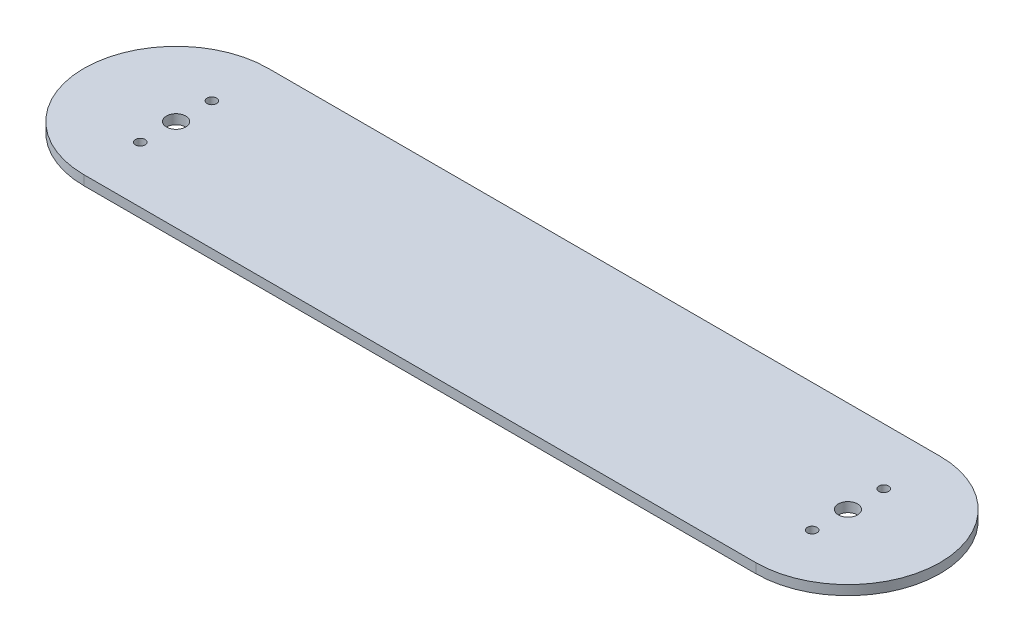
ISO-10303-21;
HEADER;
FILE_DESCRIPTION(('STEP AP214'),'2;1');
FILE_NAME('part.step','',(''),(''),'','','');
FILE_SCHEMA(('AUTOMOTIVE_DESIGN { 1 0 10303 214 1 1 1 1 }'));
ENDSEC;
DATA;
#1=APPLICATION_CONTEXT('core data for automotive mechanical design processes');
#2=APPLICATION_PROTOCOL_DEFINITION('international standard','automotive_design',2000,#1);
#3=PRODUCT_CONTEXT('',#1,'mechanical');
#4=PRODUCT('Part','Part','',(#3));
#5=PRODUCT_RELATED_PRODUCT_CATEGORY('part','',(#4));
#6=PRODUCT_DEFINITION_FORMATION('','',#4);
#7=PRODUCT_DEFINITION_CONTEXT('part definition',#1,'design');
#8=PRODUCT_DEFINITION('design','',#6,#7);
#9=PRODUCT_DEFINITION_SHAPE('','',#8);
#10=(LENGTH_UNIT() NAMED_UNIT(*) SI_UNIT(.MILLI.,.METRE.));
#11=(NAMED_UNIT(*) PLANE_ANGLE_UNIT() SI_UNIT($,.RADIAN.));
#12=(NAMED_UNIT(*) SI_UNIT($,.STERADIAN.) SOLID_ANGLE_UNIT());
#13=UNCERTAINTY_MEASURE_WITH_UNIT(LENGTH_MEASURE(1.E-05),#10,'distance_accuracy_value','');
#14=(GEOMETRIC_REPRESENTATION_CONTEXT(3) GLOBAL_UNCERTAINTY_ASSIGNED_CONTEXT((#13)) GLOBAL_UNIT_ASSIGNED_CONTEXT((#10,
#11,#12)) REPRESENTATION_CONTEXT('',''));
#15=CARTESIAN_POINT('',(0.,0.,0.));
#16=DIRECTION('',(0.,0.,1.));
#17=DIRECTION('',(1.,0.,0.));
#18=AXIS2_PLACEMENT_3D('',#15,#16,#17);
#19=CARTESIAN_POINT('',(-175.,5.,0.));
#20=DIRECTION('',(0.,-1.,0.));
#21=DIRECTION('',(0.,0.,-1.));
#22=AXIS2_PLACEMENT_3D('',#19,#20,#21);
#23=CYLINDRICAL_SURFACE('',#22,48.);
#24=CARTESIAN_POINT('',(-175.,0.,0.));
#25=DIRECTION('',(0.,1.,0.));
#26=DIRECTION('',(0.,0.,1.));
#27=AXIS2_PLACEMENT_3D('',#24,#25,#26);
#28=CIRCLE('',#27,48.);
#29=CARTESIAN_POINT('',(-175.,0.,-48.));
#30=VERTEX_POINT('',#29);
#31=CARTESIAN_POINT('',(-175.,0.,48.));
#32=VERTEX_POINT('',#31);
#33=EDGE_CURVE('E102',#30,#32,#28,.T.);
#34=ORIENTED_EDGE('',*,*,#33,.T.);
#35=DIRECTION('',(0.,-1.,0.));
#36=VECTOR('',#35,1.);
#37=CARTESIAN_POINT('',(-175.,5.,48.));
#38=LINE('',#37,#36);
#39=CARTESIAN_POINT('',(-175.,5.,48.));
#40=VERTEX_POINT('',#39);
#41=EDGE_CURVE('E11',#40,#32,#38,.T.);
#42=ORIENTED_EDGE('',*,*,#41,.F.);
#43=CARTESIAN_POINT('',(-175.,5.,0.));
#44=DIRECTION('',(0.,1.,0.));
#45=DIRECTION('',(0.,0.,1.));
#46=AXIS2_PLACEMENT_3D('',#43,#44,#45);
#47=CIRCLE('',#46,48.);
#48=CARTESIAN_POINT('',(-175.,5.,-48.));
#49=VERTEX_POINT('',#48);
#50=EDGE_CURVE('E90',#49,#40,#47,.T.);
#51=ORIENTED_EDGE('',*,*,#50,.F.);
#52=DIRECTION('',(0.,-1.,0.));
#53=VECTOR('',#52,1.);
#54=CARTESIAN_POINT('',(-175.,5.,-48.));
#55=LINE('',#54,#53);
#56=EDGE_CURVE('E98',#49,#30,#55,.T.);
#57=ORIENTED_EDGE('',*,*,#56,.T.);
#58=EDGE_LOOP('',(#34,#42,#51,#57));
#59=FACE_BOUND('',#58,.T.);
#60=ADVANCED_FACE('F39',(#59),#23,.T.);
#61=CARTESIAN_POINT('',(175.,5.,48.));
#62=DIRECTION('',(0.,0.,-1.));
#63=DIRECTION('',(-1.,0.,0.));
#64=AXIS2_PLACEMENT_3D('',#61,#62,#63);
#65=PLANE('',#64);
#66=DIRECTION('',(1.,0.,0.));
#67=VECTOR('',#66,1.);
#68=CARTESIAN_POINT('',(175.,0.,48.));
#69=LINE('',#68,#67);
#70=CARTESIAN_POINT('',(175.,0.,48.));
#71=VERTEX_POINT('',#70);
#72=EDGE_CURVE('E94',#32,#71,#69,.T.);
#73=ORIENTED_EDGE('',*,*,#72,.T.);
#74=DIRECTION('',(0.,-1.,0.));
#75=VECTOR('',#74,1.);
#76=CARTESIAN_POINT('',(175.,5.,48.));
#77=LINE('',#76,#75);
#78=CARTESIAN_POINT('',(175.,5.,48.));
#79=VERTEX_POINT('',#78);
#80=EDGE_CURVE('E47',#79,#71,#77,.T.);
#81=ORIENTED_EDGE('',*,*,#80,.F.);
#82=DIRECTION('',(1.,0.,0.));
#83=VECTOR('',#82,1.);
#84=CARTESIAN_POINT('',(175.,5.,48.));
#85=LINE('',#84,#83);
#86=EDGE_CURVE('E85',#40,#79,#85,.T.);
#87=ORIENTED_EDGE('',*,*,#86,.F.);
#88=ORIENTED_EDGE('',*,*,#41,.T.);
#89=EDGE_LOOP('',(#73,#81,#87,#88));
#90=FACE_BOUND('',#89,.T.);
#91=ADVANCED_FACE('F93',(#90),#65,.F.);
#92=CARTESIAN_POINT('',(175.,5.,0.));
#93=DIRECTION('',(0.,-1.,0.));
#94=DIRECTION('',(0.,0.,-1.));
#95=AXIS2_PLACEMENT_3D('',#92,#93,#94);
#96=CYLINDRICAL_SURFACE('',#95,48.);
#97=CARTESIAN_POINT('',(175.,0.,0.));
#98=DIRECTION('',(0.,1.,0.));
#99=DIRECTION('',(0.,0.,1.));
#100=AXIS2_PLACEMENT_3D('',#97,#98,#99);
#101=CIRCLE('',#100,48.);
#102=CARTESIAN_POINT('',(175.,0.,-48.));
#103=VERTEX_POINT('',#102);
#104=EDGE_CURVE('E72',#71,#103,#101,.T.);
#105=ORIENTED_EDGE('',*,*,#104,.T.);
#106=DIRECTION('',(0.,-1.,0.));
#107=VECTOR('',#106,1.);
#108=CARTESIAN_POINT('',(175.,5.,-48.));
#109=LINE('',#108,#107);
#110=CARTESIAN_POINT('',(175.,5.,-48.));
#111=VERTEX_POINT('',#110);
#112=EDGE_CURVE('E95',#111,#103,#109,.T.);
#113=ORIENTED_EDGE('',*,*,#112,.F.);
#114=CARTESIAN_POINT('',(175.,5.,0.));
#115=DIRECTION('',(0.,1.,0.));
#116=DIRECTION('',(0.,0.,1.));
#117=AXIS2_PLACEMENT_3D('',#114,#115,#116);
#118=CIRCLE('',#117,48.);
#119=EDGE_CURVE('E88',#79,#111,#118,.T.);
#120=ORIENTED_EDGE('',*,*,#119,.F.);
#121=ORIENTED_EDGE('',*,*,#80,.T.);
#122=EDGE_LOOP('',(#105,#113,#120,#121));
#123=FACE_BOUND('',#122,.T.);
#124=ADVANCED_FACE('F96',(#123),#96,.T.);
#125=CARTESIAN_POINT('',(-175.,5.,-48.));
#126=DIRECTION('',(0.,0.,1.));
#127=DIRECTION('',(1.,0.,0.));
#128=AXIS2_PLACEMENT_3D('',#125,#126,#127);
#129=PLANE('',#128);
#130=DIRECTION('',(-1.,0.,0.));
#131=VECTOR('',#130,1.);
#132=CARTESIAN_POINT('',(-175.,0.,-48.));
#133=LINE('',#132,#131);
#134=EDGE_CURVE('E78',#103,#30,#133,.T.);
#135=ORIENTED_EDGE('',*,*,#134,.T.);
#136=ORIENTED_EDGE('',*,*,#56,.F.);
#137=DIRECTION('',(-1.,0.,0.));
#138=VECTOR('',#137,1.);
#139=CARTESIAN_POINT('',(-175.,5.,-48.));
#140=LINE('',#139,#138);
#141=EDGE_CURVE('E55',#111,#49,#140,.T.);
#142=ORIENTED_EDGE('',*,*,#141,.F.);
#143=ORIENTED_EDGE('',*,*,#112,.T.);
#144=EDGE_LOOP('',(#135,#136,#142,#143));
#145=FACE_BOUND('',#144,.T.);
#146=ADVANCED_FACE('F110',(#145),#129,.F.);
#147=CARTESIAN_POINT('',(-175.,5.,0.));
#148=DIRECTION('',(0.,1.,0.));
#149=DIRECTION('',(0.,0.,1.));
#150=AXIS2_PLACEMENT_3D('',#147,#148,#149);
#151=PLANE('',#150);
#152=CARTESIAN_POINT('',(175.,5.,18.65));
#153=DIRECTION('',(0.,1.,0.));
#154=DIRECTION('',(0.,0.,1.));
#155=AXIS2_PLACEMENT_3D('',#152,#153,#154);
#156=CIRCLE('',#155,2.50000000000002);
#157=CARTESIAN_POINT('',(175.,5.,21.15));
#158=VERTEX_POINT('',#157);
#159=EDGE_CURVE('E105',#158,#158,#156,.T.);
#160=ORIENTED_EDGE('',*,*,#159,.F.);
#161=EDGE_LOOP('',(#160));
#162=FACE_BOUND('',#161,.T.);
#163=CARTESIAN_POINT('',(175.,5.,-18.65));
#164=DIRECTION('',(0.,1.,0.));
#165=DIRECTION('',(0.,0.,1.));
#166=AXIS2_PLACEMENT_3D('',#163,#164,#165);
#167=CIRCLE('',#166,2.50000000000002);
#168=CARTESIAN_POINT('',(175.,5.,-16.15));
#169=VERTEX_POINT('',#168);
#170=EDGE_CURVE('E118',#169,#169,#167,.T.);
#171=ORIENTED_EDGE('',*,*,#170,.F.);
#172=EDGE_LOOP('',(#171));
#173=FACE_BOUND('',#172,.T.);
#174=CARTESIAN_POINT('',(-175.,5.,-18.65));
#175=DIRECTION('',(0.,1.,0.));
#176=DIRECTION('',(0.,0.,1.));
#177=AXIS2_PLACEMENT_3D('',#174,#175,#176);
#178=CIRCLE('',#177,2.50000000000002);
#179=CARTESIAN_POINT('',(-175.,5.,-16.15));
#180=VERTEX_POINT('',#179);
#181=EDGE_CURVE('E121',#180,#180,#178,.T.);
#182=ORIENTED_EDGE('',*,*,#181,.F.);
#183=EDGE_LOOP('',(#182));
#184=FACE_BOUND('',#183,.T.);
#185=CARTESIAN_POINT('',(-175.,5.,18.65));
#186=DIRECTION('',(0.,1.,0.));
#187=DIRECTION('',(0.,0.,1.));
#188=AXIS2_PLACEMENT_3D('',#185,#186,#187);
#189=CIRCLE('',#188,2.50000000000002);
#190=CARTESIAN_POINT('',(-175.,5.,21.15));
#191=VERTEX_POINT('',#190);
#192=EDGE_CURVE('E124',#191,#191,#189,.T.);
#193=ORIENTED_EDGE('',*,*,#192,.F.);
#194=EDGE_LOOP('',(#193));
#195=FACE_BOUND('',#194,.T.);
#196=CARTESIAN_POINT('',(-175.,5.,0.));
#197=DIRECTION('',(0.,1.,0.));
#198=DIRECTION('',(0.,0.,1.));
#199=AXIS2_PLACEMENT_3D('',#196,#197,#198);
#200=CIRCLE('',#199,4.99999999999999);
#201=CARTESIAN_POINT('',(-175.,5.,4.99999999999999));
#202=VERTEX_POINT('',#201);
#203=EDGE_CURVE('E127',#202,#202,#200,.T.);
#204=ORIENTED_EDGE('',*,*,#203,.F.);
#205=EDGE_LOOP('',(#204));
#206=FACE_BOUND('',#205,.T.);
#207=CARTESIAN_POINT('',(175.,5.,0.));
#208=DIRECTION('',(0.,1.,0.));
#209=DIRECTION('',(0.,0.,1.));
#210=AXIS2_PLACEMENT_3D('',#207,#208,#209);
#211=CIRCLE('',#210,4.99999999999999);
#212=CARTESIAN_POINT('',(175.,5.,4.99999999999999));
#213=VERTEX_POINT('',#212);
#214=EDGE_CURVE('E130',#213,#213,#211,.T.);
#215=ORIENTED_EDGE('',*,*,#214,.F.);
#216=EDGE_LOOP('',(#215));
#217=FACE_BOUND('',#216,.T.);
#218=ORIENTED_EDGE('',*,*,#50,.T.);
#219=ORIENTED_EDGE('',*,*,#86,.T.);
#220=ORIENTED_EDGE('',*,*,#119,.T.);
#221=ORIENTED_EDGE('',*,*,#141,.T.);
#222=EDGE_LOOP('',(#218,#219,#220,#221));
#223=FACE_BOUND('',#222,.T.);
#224=ADVANCED_FACE('F86',(#162,#173,#184,#195,#206,#217,#223),#151,.T.);
#225=CARTESIAN_POINT('',(-175.,0.,0.));
#226=DIRECTION('',(0.,1.,0.));
#227=DIRECTION('',(0.,0.,1.));
#228=AXIS2_PLACEMENT_3D('',#225,#226,#227);
#229=PLANE('',#228);
#230=CARTESIAN_POINT('',(175.,0.,18.65));
#231=DIRECTION('',(0.,-1.,0.));
#232=DIRECTION('',(0.,0.,-1.));
#233=AXIS2_PLACEMENT_3D('',#230,#231,#232);
#234=CIRCLE('',#233,2.50000000000002);
#235=CARTESIAN_POINT('',(175.,0.,16.15));
#236=VERTEX_POINT('',#235);
#237=EDGE_CURVE('E136',#236,#236,#234,.T.);
#238=ORIENTED_EDGE('',*,*,#237,.F.);
#239=EDGE_LOOP('',(#238));
#240=FACE_BOUND('',#239,.T.);
#241=CARTESIAN_POINT('',(175.,0.,-18.65));
#242=DIRECTION('',(0.,-1.,0.));
#243=DIRECTION('',(0.,0.,-1.));
#244=AXIS2_PLACEMENT_3D('',#241,#242,#243);
#245=CIRCLE('',#244,2.50000000000002);
#246=CARTESIAN_POINT('',(175.,0.,-21.15));
#247=VERTEX_POINT('',#246);
#248=EDGE_CURVE('E144',#247,#247,#245,.T.);
#249=ORIENTED_EDGE('',*,*,#248,.F.);
#250=EDGE_LOOP('',(#249));
#251=FACE_BOUND('',#250,.T.);
#252=CARTESIAN_POINT('',(-175.,0.,-18.65));
#253=DIRECTION('',(0.,-1.,0.));
#254=DIRECTION('',(0.,0.,1.));
#255=AXIS2_PLACEMENT_3D('',#252,#253,#254);
#256=CIRCLE('',#255,2.50000000000002);
#257=CARTESIAN_POINT('',(-175.,0.,-16.15));
#258=VERTEX_POINT('',#257);
#259=EDGE_CURVE('E140',#258,#258,#256,.T.);
#260=ORIENTED_EDGE('',*,*,#259,.F.);
#261=EDGE_LOOP('',(#260));
#262=FACE_BOUND('',#261,.T.);
#263=CARTESIAN_POINT('',(-175.,0.,18.65));
#264=DIRECTION('',(0.,-1.,0.));
#265=DIRECTION('',(0.,0.,1.));
#266=AXIS2_PLACEMENT_3D('',#263,#264,#265);
#267=CIRCLE('',#266,2.50000000000002);
#268=CARTESIAN_POINT('',(-175.,0.,21.15));
#269=VERTEX_POINT('',#268);
#270=EDGE_CURVE('E137',#269,#269,#267,.T.);
#271=ORIENTED_EDGE('',*,*,#270,.F.);
#272=EDGE_LOOP('',(#271));
#273=FACE_BOUND('',#272,.T.);
#274=CARTESIAN_POINT('',(-175.,0.,0.));
#275=DIRECTION('',(0.,-1.,0.));
#276=DIRECTION('',(0.,0.,1.));
#277=AXIS2_PLACEMENT_3D('',#274,#275,#276);
#278=CIRCLE('',#277,4.99999999999999);
#279=CARTESIAN_POINT('',(-175.,0.,4.99999999999999));
#280=VERTEX_POINT('',#279);
#281=EDGE_CURVE('E141',#280,#280,#278,.T.);
#282=ORIENTED_EDGE('',*,*,#281,.F.);
#283=EDGE_LOOP('',(#282));
#284=FACE_BOUND('',#283,.T.);
#285=CARTESIAN_POINT('',(175.,0.,0.));
#286=DIRECTION('',(0.,-1.,0.));
#287=DIRECTION('',(0.,0.,-1.));
#288=AXIS2_PLACEMENT_3D('',#285,#286,#287);
#289=CIRCLE('',#288,4.99999999999999);
#290=CARTESIAN_POINT('',(175.,0.,-4.99999999999999));
#291=VERTEX_POINT('',#290);
#292=EDGE_CURVE('E133',#291,#291,#289,.T.);
#293=ORIENTED_EDGE('',*,*,#292,.F.);
#294=EDGE_LOOP('',(#293));
#295=FACE_BOUND('',#294,.T.);
#296=ORIENTED_EDGE('',*,*,#33,.F.);
#297=ORIENTED_EDGE('',*,*,#134,.F.);
#298=ORIENTED_EDGE('',*,*,#104,.F.);
#299=ORIENTED_EDGE('',*,*,#72,.F.);
#300=EDGE_LOOP('',(#296,#297,#298,#299));
#301=FACE_BOUND('',#300,.T.);
#302=ADVANCED_FACE('F113',(#240,#251,#262,#273,#284,#295,#301),#229,.F.);
#303=CARTESIAN_POINT('',(175.,10.,0.));
#304=DIRECTION('',(0.,-1.,0.));
#305=DIRECTION('',(0.,0.,-1.));
#306=AXIS2_PLACEMENT_3D('',#303,#304,#305);
#307=CYLINDRICAL_SURFACE('',#306,4.99999999999999);
#308=ORIENTED_EDGE('',*,*,#214,.T.);
#309=EDGE_LOOP('',(#308));
#310=FACE_BOUND('',#309,.T.);
#311=ORIENTED_EDGE('',*,*,#292,.T.);
#312=EDGE_LOOP('',(#311));
#313=FACE_BOUND('',#312,.T.);
#314=ADVANCED_FACE('F156',(#310,#313),#307,.F.);
#315=CARTESIAN_POINT('',(-175.,10.,0.));
#316=DIRECTION('',(0.,-1.,0.));
#317=DIRECTION('',(0.,0.,-1.));
#318=AXIS2_PLACEMENT_3D('',#315,#316,#317);
#319=CYLINDRICAL_SURFACE('',#318,4.99999999999999);
#320=ORIENTED_EDGE('',*,*,#203,.T.);
#321=EDGE_LOOP('',(#320));
#322=FACE_BOUND('',#321,.T.);
#323=ORIENTED_EDGE('',*,*,#281,.T.);
#324=EDGE_LOOP('',(#323));
#325=FACE_BOUND('',#324,.T.);
#326=ADVANCED_FACE('F152',(#322,#325),#319,.F.);
#327=CARTESIAN_POINT('',(-175.,10.,18.65));
#328=DIRECTION('',(0.,-1.,0.));
#329=DIRECTION('',(0.,0.,-1.));
#330=AXIS2_PLACEMENT_3D('',#327,#328,#329);
#331=CYLINDRICAL_SURFACE('',#330,2.50000000000002);
#332=ORIENTED_EDGE('',*,*,#192,.T.);
#333=EDGE_LOOP('',(#332));
#334=FACE_BOUND('',#333,.T.);
#335=ORIENTED_EDGE('',*,*,#270,.T.);
#336=EDGE_LOOP('',(#335));
#337=FACE_BOUND('',#336,.T.);
#338=ADVANCED_FACE('F167',(#334,#337),#331,.F.);
#339=CARTESIAN_POINT('',(-175.,10.,-18.65));
#340=DIRECTION('',(0.,-1.,0.));
#341=DIRECTION('',(0.,0.,-1.));
#342=AXIS2_PLACEMENT_3D('',#339,#340,#341);
#343=CYLINDRICAL_SURFACE('',#342,2.50000000000002);
#344=ORIENTED_EDGE('',*,*,#181,.T.);
#345=EDGE_LOOP('',(#344));
#346=FACE_BOUND('',#345,.T.);
#347=ORIENTED_EDGE('',*,*,#259,.T.);
#348=EDGE_LOOP('',(#347));
#349=FACE_BOUND('',#348,.T.);
#350=ADVANCED_FACE('F200',(#346,#349),#343,.F.);
#351=CARTESIAN_POINT('',(175.,10.,-18.65));
#352=DIRECTION('',(0.,-1.,0.));
#353=DIRECTION('',(0.,0.,-1.));
#354=AXIS2_PLACEMENT_3D('',#351,#352,#353);
#355=CYLINDRICAL_SURFACE('',#354,2.50000000000002);
#356=ORIENTED_EDGE('',*,*,#170,.T.);
#357=EDGE_LOOP('',(#356));
#358=FACE_BOUND('',#357,.T.);
#359=ORIENTED_EDGE('',*,*,#248,.T.);
#360=EDGE_LOOP('',(#359));
#361=FACE_BOUND('',#360,.T.);
#362=ADVANCED_FACE('F206',(#358,#361),#355,.F.);
#363=CARTESIAN_POINT('',(175.,10.,18.65));
#364=DIRECTION('',(0.,-1.,0.));
#365=DIRECTION('',(0.,0.,-1.));
#366=AXIS2_PLACEMENT_3D('',#363,#364,#365);
#367=CYLINDRICAL_SURFACE('',#366,2.50000000000002);
#368=ORIENTED_EDGE('',*,*,#159,.T.);
#369=EDGE_LOOP('',(#368));
#370=FACE_BOUND('',#369,.T.);
#371=ORIENTED_EDGE('',*,*,#237,.T.);
#372=EDGE_LOOP('',(#371));
#373=FACE_BOUND('',#372,.T.);
#374=ADVANCED_FACE('F212',(#370,#373),#367,.F.);
#375=CLOSED_SHELL('',(#60,#91,#124,#146,#224,#302,#314,#326,#338,#350,#362,#374));
#376=MANIFOLD_SOLID_BREP('B2',#375);
#377=ADVANCED_BREP_SHAPE_REPRESENTATION('',(#18,#376),#14);
#378=SHAPE_DEFINITION_REPRESENTATION(#9,#377);
ENDSEC;
END-ISO-10303-21;
